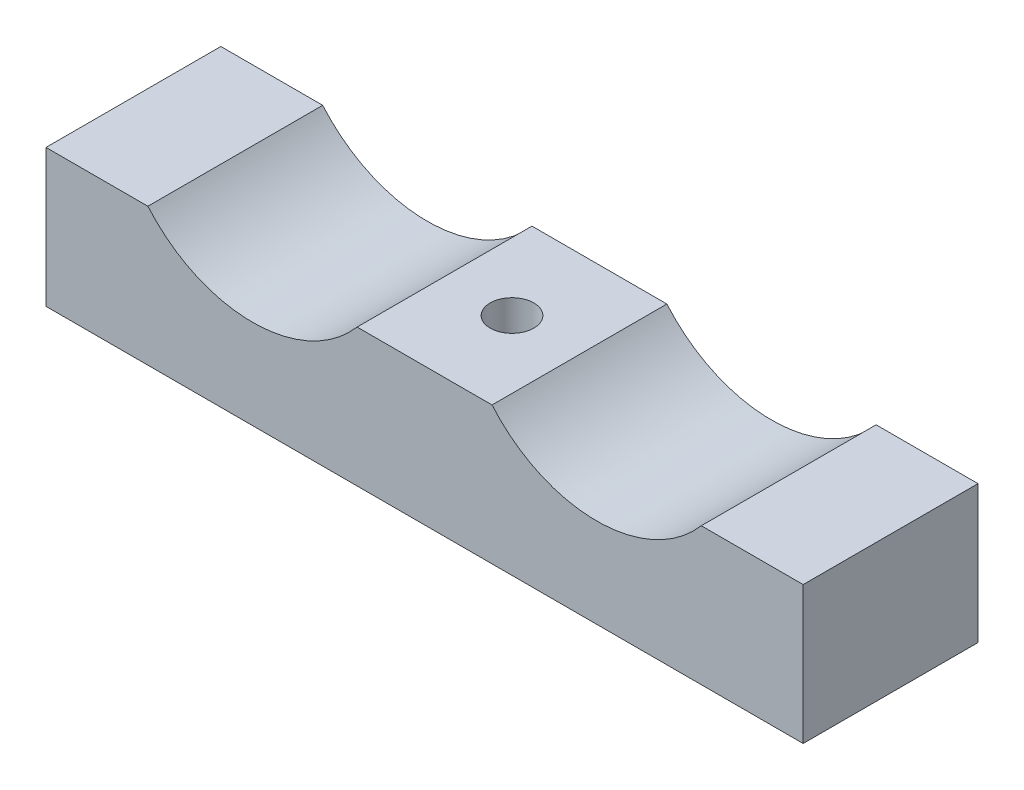
ISO-10303-21;
HEADER;
FILE_DESCRIPTION(('STEP AP214'),'2;1');
FILE_NAME('part.step','',(''),(''),'','','');
FILE_SCHEMA(('AUTOMOTIVE_DESIGN { 1 0 10303 214 1 1 1 1 }'));
ENDSEC;
DATA;
#1=APPLICATION_CONTEXT('core data for automotive mechanical design processes');
#2=APPLICATION_PROTOCOL_DEFINITION('international standard','automotive_design',2000,#1);
#3=PRODUCT_CONTEXT('',#1,'mechanical');
#4=PRODUCT('Part','Part','',(#3));
#5=PRODUCT_RELATED_PRODUCT_CATEGORY('part','',(#4));
#6=PRODUCT_DEFINITION_FORMATION('','',#4);
#7=PRODUCT_DEFINITION_CONTEXT('part definition',#1,'design');
#8=PRODUCT_DEFINITION('design','',#6,#7);
#9=PRODUCT_DEFINITION_SHAPE('','',#8);
#10=(LENGTH_UNIT() NAMED_UNIT(*) SI_UNIT(.MILLI.,.METRE.));
#11=(NAMED_UNIT(*) PLANE_ANGLE_UNIT() SI_UNIT($,.RADIAN.));
#12=(NAMED_UNIT(*) SI_UNIT($,.STERADIAN.) SOLID_ANGLE_UNIT());
#13=UNCERTAINTY_MEASURE_WITH_UNIT(LENGTH_MEASURE(1.E-05),#10,'distance_accuracy_value','');
#14=(GEOMETRIC_REPRESENTATION_CONTEXT(3) GLOBAL_UNCERTAINTY_ASSIGNED_CONTEXT((#13)) GLOBAL_UNIT_ASSIGNED_CONTEXT((#10,
#11,#12)) REPRESENTATION_CONTEXT('',''));
#15=CARTESIAN_POINT('',(0.,0.,0.));
#16=DIRECTION('',(0.,0.,1.));
#17=DIRECTION('',(1.,0.,0.));
#18=AXIS2_PLACEMENT_3D('',#15,#16,#17);
#19=CARTESIAN_POINT('',(0.,10.,12.7));
#20=DIRECTION('',(0.,-1.,0.));
#21=DIRECTION('',(0.,0.,-1.));
#22=AXIS2_PLACEMENT_3D('',#19,#20,#21);
#23=PLANE('',#22);
#24=DIRECTION('',(-1.,0.,0.));
#25=VECTOR('',#24,1.);
#26=CARTESIAN_POINT('',(0.,10.,0.));
#27=LINE('',#26,#25);
#28=CARTESIAN_POINT('',(55.,10.,0.));
#29=VERTEX_POINT('',#28);
#30=CARTESIAN_POINT('',(47.5993420767853,10.,0.));
#31=VERTEX_POINT('',#30);
#32=EDGE_CURVE('E116',#29,#31,#27,.T.);
#33=ORIENTED_EDGE('',*,*,#32,.T.);
#34=DIRECTION('',(0.,0.,1.));
#35=VECTOR('',#34,1.);
#36=CARTESIAN_POINT('',(47.5993420767853,10.,0.));
#37=LINE('',#36,#35);
#38=CARTESIAN_POINT('',(47.5993420767853,10.,12.7));
#39=VERTEX_POINT('',#38);
#40=EDGE_CURVE('E50',#31,#39,#37,.T.);
#41=ORIENTED_EDGE('',*,*,#40,.T.);
#42=DIRECTION('',(-1.,0.,0.));
#43=VECTOR('',#42,1.);
#44=CARTESIAN_POINT('',(0.,10.,12.7));
#45=LINE('',#44,#43);
#46=CARTESIAN_POINT('',(55.,10.,12.7));
#47=VERTEX_POINT('',#46);
#48=EDGE_CURVE('E128',#47,#39,#45,.T.);
#49=ORIENTED_EDGE('',*,*,#48,.F.);
#50=DIRECTION('',(0.,0.,-1.));
#51=VECTOR('',#50,1.);
#52=CARTESIAN_POINT('',(55.,10.,12.7));
#53=LINE('',#52,#51);
#54=EDGE_CURVE('E127',#47,#29,#53,.T.);
#55=ORIENTED_EDGE('',*,*,#54,.T.);
#56=EDGE_LOOP('',(#33,#41,#49,#55));
#57=FACE_BOUND('',#56,.T.);
#58=ADVANCED_FACE('F35',(#57),#23,.F.);
#59=CARTESIAN_POINT('',(27.5,10.,6.35));
#60=DIRECTION('',(0.,1.,0.));
#61=DIRECTION('',(0.,0.,1.));
#62=AXIS2_PLACEMENT_3D('',#59,#60,#61);
#63=CIRCLE('',#62,1.5875);
#64=CARTESIAN_POINT('',(27.5,10.,7.9375));
#65=VERTEX_POINT('',#64);
#66=EDGE_CURVE('E165',#65,#65,#63,.T.);
#67=ORIENTED_EDGE('',*,*,#66,.F.);
#68=EDGE_LOOP('',(#67));
#69=FACE_BOUND('',#68,.T.);
#70=CARTESIAN_POINT('',(32.4006579232147,10.,12.7));
#71=VERTEX_POINT('',#70);
#72=CARTESIAN_POINT('',(22.5993420767853,10.,12.7));
#73=VERTEX_POINT('',#72);
#74=EDGE_CURVE('E110',#71,#73,#45,.T.);
#75=ORIENTED_EDGE('',*,*,#74,.F.);
#76=DIRECTION('',(0.,0.,1.));
#77=VECTOR('',#76,1.);
#78=CARTESIAN_POINT('',(32.4006579232147,10.,0.));
#79=LINE('',#78,#77);
#80=CARTESIAN_POINT('',(32.4006579232147,10.,0.));
#81=VERTEX_POINT('',#80);
#82=EDGE_CURVE('E101',#71,#81,#79,.F.);
#83=ORIENTED_EDGE('',*,*,#82,.T.);
#84=CARTESIAN_POINT('',(22.5993420767853,10.,0.));
#85=VERTEX_POINT('',#84);
#86=EDGE_CURVE('E58',#81,#85,#27,.T.);
#87=ORIENTED_EDGE('',*,*,#86,.T.);
#88=DIRECTION('',(0.,0.,1.));
#89=VECTOR('',#88,1.);
#90=CARTESIAN_POINT('',(22.5993420767853,10.,0.));
#91=LINE('',#90,#89);
#92=EDGE_CURVE('E143',#85,#73,#91,.T.);
#93=ORIENTED_EDGE('',*,*,#92,.T.);
#94=EDGE_LOOP('',(#75,#83,#87,#93));
#95=FACE_BOUND('',#94,.T.);
#96=ADVANCED_FACE('F109',(#69,#95),#23,.F.);
#97=CARTESIAN_POINT('',(0.,0.,12.7));
#98=DIRECTION('',(1.,0.,0.));
#99=DIRECTION('',(0.,0.,-1.));
#100=AXIS2_PLACEMENT_3D('',#97,#98,#99);
#101=PLANE('',#100);
#102=DIRECTION('',(0.,-1.,0.));
#103=VECTOR('',#102,1.);
#104=CARTESIAN_POINT('',(0.,0.,0.));
#105=LINE('',#104,#103);
#106=CARTESIAN_POINT('',(0.,10.,0.));
#107=VERTEX_POINT('',#106);
#108=CARTESIAN_POINT('',(0.,0.,0.));
#109=VERTEX_POINT('',#108);
#110=EDGE_CURVE('E141',#107,#109,#105,.T.);
#111=ORIENTED_EDGE('',*,*,#110,.T.);
#112=DIRECTION('',(0.,0.,-1.));
#113=VECTOR('',#112,1.);
#114=CARTESIAN_POINT('',(0.,0.,12.7));
#115=LINE('',#114,#113);
#116=CARTESIAN_POINT('',(0.,0.,12.7));
#117=VERTEX_POINT('',#116);
#118=EDGE_CURVE('E11',#117,#109,#115,.T.);
#119=ORIENTED_EDGE('',*,*,#118,.F.);
#120=DIRECTION('',(0.,-1.,0.));
#121=VECTOR('',#120,1.);
#122=CARTESIAN_POINT('',(0.,0.,12.7));
#123=LINE('',#122,#121);
#124=CARTESIAN_POINT('',(0.,10.,12.7));
#125=VERTEX_POINT('',#124);
#126=EDGE_CURVE('E119',#125,#117,#123,.T.);
#127=ORIENTED_EDGE('',*,*,#126,.F.);
#128=DIRECTION('',(0.,0.,-1.));
#129=VECTOR('',#128,1.);
#130=CARTESIAN_POINT('',(0.,10.,12.7));
#131=LINE('',#130,#129);
#132=EDGE_CURVE('E124',#125,#107,#131,.T.);
#133=ORIENTED_EDGE('',*,*,#132,.T.);
#134=EDGE_LOOP('',(#111,#119,#127,#133));
#135=FACE_BOUND('',#134,.T.);
#136=ADVANCED_FACE('F37',(#135),#101,.F.);
#137=CARTESIAN_POINT('',(0.,0.,12.7));
#138=DIRECTION('',(0.,1.,0.));
#139=DIRECTION('',(0.,0.,1.));
#140=AXIS2_PLACEMENT_3D('',#137,#138,#139);
#141=PLANE('',#140);
#142=CARTESIAN_POINT('',(27.5,0.,6.35));
#143=DIRECTION('',(0.,1.,0.));
#144=DIRECTION('',(0.,0.,1.));
#145=AXIS2_PLACEMENT_3D('',#142,#143,#144);
#146=CIRCLE('',#145,1.5875);
#147=CARTESIAN_POINT('',(27.5,0.,7.9375));
#148=VERTEX_POINT('',#147);
#149=EDGE_CURVE('E163',#148,#148,#146,.T.);
#150=ORIENTED_EDGE('',*,*,#149,.T.);
#151=EDGE_LOOP('',(#150));
#152=FACE_BOUND('',#151,.T.);
#153=DIRECTION('',(1.,0.,0.));
#154=VECTOR('',#153,1.);
#155=CARTESIAN_POINT('',(0.,0.,0.));
#156=LINE('',#155,#154);
#157=CARTESIAN_POINT('',(55.,0.,0.));
#158=VERTEX_POINT('',#157);
#159=EDGE_CURVE('E140',#109,#158,#156,.T.);
#160=ORIENTED_EDGE('',*,*,#159,.T.);
#161=DIRECTION('',(0.,0.,-1.));
#162=VECTOR('',#161,1.);
#163=CARTESIAN_POINT('',(55.,0.,12.7));
#164=LINE('',#163,#162);
#165=CARTESIAN_POINT('',(55.,0.,12.7));
#166=VERTEX_POINT('',#165);
#167=EDGE_CURVE('E43',#166,#158,#164,.T.);
#168=ORIENTED_EDGE('',*,*,#167,.F.);
#169=DIRECTION('',(1.,0.,0.));
#170=VECTOR('',#169,1.);
#171=CARTESIAN_POINT('',(0.,0.,12.7));
#172=LINE('',#171,#170);
#173=EDGE_CURVE('E150',#117,#166,#172,.T.);
#174=ORIENTED_EDGE('',*,*,#173,.F.);
#175=ORIENTED_EDGE('',*,*,#118,.T.);
#176=EDGE_LOOP('',(#160,#168,#174,#175));
#177=FACE_BOUND('',#176,.T.);
#178=ADVANCED_FACE('F171',(#152,#177),#141,.F.);
#179=CARTESIAN_POINT('',(55.,0.,12.7));
#180=DIRECTION('',(-1.,0.,0.));
#181=DIRECTION('',(0.,0.,1.));
#182=AXIS2_PLACEMENT_3D('',#179,#180,#181);
#183=PLANE('',#182);
#184=DIRECTION('',(0.,1.,0.));
#185=VECTOR('',#184,1.);
#186=CARTESIAN_POINT('',(55.,0.,0.));
#187=LINE('',#186,#185);
#188=EDGE_CURVE('E120',#158,#29,#187,.T.);
#189=ORIENTED_EDGE('',*,*,#188,.T.);
#190=ORIENTED_EDGE('',*,*,#54,.F.);
#191=DIRECTION('',(0.,1.,0.));
#192=VECTOR('',#191,1.);
#193=CARTESIAN_POINT('',(55.,0.,12.7));
#194=LINE('',#193,#192);
#195=EDGE_CURVE('E137',#166,#47,#194,.T.);
#196=ORIENTED_EDGE('',*,*,#195,.F.);
#197=ORIENTED_EDGE('',*,*,#167,.T.);
#198=EDGE_LOOP('',(#189,#190,#196,#197));
#199=FACE_BOUND('',#198,.T.);
#200=ADVANCED_FACE('F135',(#199),#183,.F.);
#201=CARTESIAN_POINT('',(7.40065792321467,10.,12.7));
#202=VERTEX_POINT('',#201);
#203=EDGE_CURVE('E148',#202,#125,#45,.T.);
#204=ORIENTED_EDGE('',*,*,#203,.F.);
#205=DIRECTION('',(0.,0.,1.));
#206=VECTOR('',#205,1.);
#207=CARTESIAN_POINT('',(7.40065792321467,10.,0.));
#208=LINE('',#207,#206);
#209=CARTESIAN_POINT('',(7.40065792321467,10.,0.));
#210=VERTEX_POINT('',#209);
#211=EDGE_CURVE('E155',#202,#210,#208,.F.);
#212=ORIENTED_EDGE('',*,*,#211,.T.);
#213=EDGE_CURVE('E117',#210,#107,#27,.T.);
#214=ORIENTED_EDGE('',*,*,#213,.T.);
#215=ORIENTED_EDGE('',*,*,#132,.F.);
#216=EDGE_LOOP('',(#204,#212,#214,#215));
#217=FACE_BOUND('',#216,.T.);
#218=ADVANCED_FACE('F181',(#217),#23,.F.);
#219=CARTESIAN_POINT('',(0.,0.,12.7));
#220=DIRECTION('',(0.,0.,-1.));
#221=DIRECTION('',(-1.,0.,0.));
#222=AXIS2_PLACEMENT_3D('',#219,#220,#221);
#223=PLANE('',#222);
#224=ORIENTED_EDGE('',*,*,#48,.T.);
#225=CARTESIAN_POINT('',(40.,16.5,12.7));
#226=DIRECTION('',(0.,0.,1.));
#227=DIRECTION('',(1.,0.,0.));
#228=AXIS2_PLACEMENT_3D('',#225,#226,#227);
#229=CIRCLE('',#228,10.);
#230=EDGE_CURVE('E106',#71,#39,#229,.T.);
#231=ORIENTED_EDGE('',*,*,#230,.F.);
#232=ORIENTED_EDGE('',*,*,#74,.T.);
#233=CARTESIAN_POINT('',(15.,16.5,12.7));
#234=DIRECTION('',(0.,0.,1.));
#235=DIRECTION('',(1.,0.,0.));
#236=AXIS2_PLACEMENT_3D('',#233,#234,#235);
#237=CIRCLE('',#236,10.);
#238=EDGE_CURVE('E158',#202,#73,#237,.T.);
#239=ORIENTED_EDGE('',*,*,#238,.F.);
#240=ORIENTED_EDGE('',*,*,#203,.T.);
#241=ORIENTED_EDGE('',*,*,#126,.T.);
#242=ORIENTED_EDGE('',*,*,#173,.T.);
#243=ORIENTED_EDGE('',*,*,#195,.T.);
#244=EDGE_LOOP('',(#224,#231,#232,#239,#240,#241,#242,#243));
#245=FACE_BOUND('',#244,.T.);
#246=ADVANCED_FACE('F191',(#245),#223,.F.);
#247=CARTESIAN_POINT('',(0.,0.,0.));
#248=DIRECTION('',(0.,0.,-1.));
#249=DIRECTION('',(-1.,0.,0.));
#250=AXIS2_PLACEMENT_3D('',#247,#248,#249);
#251=PLANE('',#250);
#252=CARTESIAN_POINT('',(40.,16.5,0.));
#253=DIRECTION('',(0.,0.,1.));
#254=DIRECTION('',(1.,0.,0.));
#255=AXIS2_PLACEMENT_3D('',#252,#253,#254);
#256=CIRCLE('',#255,10.);
#257=EDGE_CURVE('E99',#81,#31,#256,.T.);
#258=ORIENTED_EDGE('',*,*,#257,.T.);
#259=ORIENTED_EDGE('',*,*,#32,.F.);
#260=ORIENTED_EDGE('',*,*,#188,.F.);
#261=ORIENTED_EDGE('',*,*,#159,.F.);
#262=ORIENTED_EDGE('',*,*,#110,.F.);
#263=ORIENTED_EDGE('',*,*,#213,.F.);
#264=CARTESIAN_POINT('',(15.,16.5,0.));
#265=DIRECTION('',(0.,0.,1.));
#266=DIRECTION('',(1.,0.,0.));
#267=AXIS2_PLACEMENT_3D('',#264,#265,#266);
#268=CIRCLE('',#267,10.);
#269=EDGE_CURVE('E115',#210,#85,#268,.T.);
#270=ORIENTED_EDGE('',*,*,#269,.T.);
#271=ORIENTED_EDGE('',*,*,#86,.F.);
#272=EDGE_LOOP('',(#258,#259,#260,#261,#262,#263,#270,#271));
#273=FACE_BOUND('',#272,.T.);
#274=ADVANCED_FACE('F113',(#273),#251,.T.);
#275=CARTESIAN_POINT('',(15.,16.5,0.));
#276=DIRECTION('',(0.,0.,1.));
#277=DIRECTION('',(1.,0.,0.));
#278=AXIS2_PLACEMENT_3D('',#275,#276,#277);
#279=CYLINDRICAL_SURFACE('',#278,10.);
#280=ORIENTED_EDGE('',*,*,#269,.F.);
#281=ORIENTED_EDGE('',*,*,#211,.F.);
#282=ORIENTED_EDGE('',*,*,#238,.T.);
#283=ORIENTED_EDGE('',*,*,#92,.F.);
#284=EDGE_LOOP('',(#280,#281,#282,#283));
#285=FACE_BOUND('',#284,.T.);
#286=ADVANCED_FACE('F204',(#285),#279,.F.);
#287=CARTESIAN_POINT('',(40.,16.5,0.));
#288=DIRECTION('',(0.,0.,1.));
#289=DIRECTION('',(1.,0.,0.));
#290=AXIS2_PLACEMENT_3D('',#287,#288,#289);
#291=CYLINDRICAL_SURFACE('',#290,10.);
#292=ORIENTED_EDGE('',*,*,#257,.F.);
#293=ORIENTED_EDGE('',*,*,#82,.F.);
#294=ORIENTED_EDGE('',*,*,#230,.T.);
#295=ORIENTED_EDGE('',*,*,#40,.F.);
#296=EDGE_LOOP('',(#292,#293,#294,#295));
#297=FACE_BOUND('',#296,.T.);
#298=ADVANCED_FACE('F100',(#297),#291,.F.);
#299=CARTESIAN_POINT('',(27.5,0.,6.35));
#300=DIRECTION('',(0.,1.,0.));
#301=DIRECTION('',(0.,0.,1.));
#302=AXIS2_PLACEMENT_3D('',#299,#300,#301);
#303=CYLINDRICAL_SURFACE('',#302,1.5875);
#304=ORIENTED_EDGE('',*,*,#149,.F.);
#305=EDGE_LOOP('',(#304));
#306=FACE_BOUND('',#305,.T.);
#307=ORIENTED_EDGE('',*,*,#66,.T.);
#308=EDGE_LOOP('',(#307));
#309=FACE_BOUND('',#308,.T.);
#310=ADVANCED_FACE('F173',(#306,#309),#303,.F.);
#311=CLOSED_SHELL('',(#58,#96,#136,#178,#200,#218,#246,#274,#286,#298,#310));
#312=MANIFOLD_SOLID_BREP('B2',#311);
#313=ADVANCED_BREP_SHAPE_REPRESENTATION('',(#18,#312),#14);
#314=SHAPE_DEFINITION_REPRESENTATION(#9,#313);
ENDSEC;
END-ISO-10303-21;
